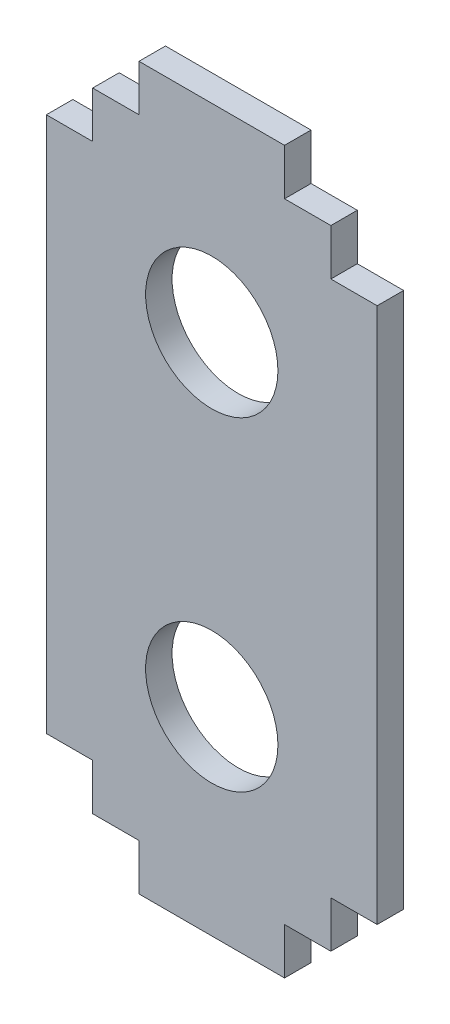
ISO-10303-21;
HEADER;
FILE_DESCRIPTION(('STEP AP214'),'2;1');
FILE_NAME('part.step','',(''),(''),'','','');
FILE_SCHEMA(('AUTOMOTIVE_DESIGN { 1 0 10303 214 1 1 1 1 }'));
ENDSEC;
DATA;
#1=APPLICATION_CONTEXT('core data for automotive mechanical design processes');
#2=APPLICATION_PROTOCOL_DEFINITION('international standard','automotive_design',2000,#1);
#3=PRODUCT_CONTEXT('',#1,'mechanical');
#4=PRODUCT('Part','Part','',(#3));
#5=PRODUCT_RELATED_PRODUCT_CATEGORY('part','',(#4));
#6=PRODUCT_DEFINITION_FORMATION('','',#4);
#7=PRODUCT_DEFINITION_CONTEXT('part definition',#1,'design');
#8=PRODUCT_DEFINITION('design','',#6,#7);
#9=PRODUCT_DEFINITION_SHAPE('','',#8);
#10=(LENGTH_UNIT() NAMED_UNIT(*) SI_UNIT(.MILLI.,.METRE.));
#11=(NAMED_UNIT(*) PLANE_ANGLE_UNIT() SI_UNIT($,.RADIAN.));
#12=(NAMED_UNIT(*) SI_UNIT($,.STERADIAN.) SOLID_ANGLE_UNIT());
#13=UNCERTAINTY_MEASURE_WITH_UNIT(LENGTH_MEASURE(1.E-05),#10,'distance_accuracy_value','');
#14=(GEOMETRIC_REPRESENTATION_CONTEXT(3) GLOBAL_UNCERTAINTY_ASSIGNED_CONTEXT((#13)) GLOBAL_UNIT_ASSIGNED_CONTEXT((#10,
#11,#12)) REPRESENTATION_CONTEXT('',''));
#15=CARTESIAN_POINT('',(0.,0.,0.));
#16=DIRECTION('',(0.,0.,1.));
#17=DIRECTION('',(1.,0.,0.));
#18=AXIS2_PLACEMENT_3D('',#15,#16,#17);
#19=CARTESIAN_POINT('',(-25.,16.,-4.));
#20=DIRECTION('',(0.,1.,0.));
#21=DIRECTION('',(0.,0.,1.));
#22=AXIS2_PLACEMENT_3D('',#19,#20,#21);
#23=PLANE('',#22);
#24=DIRECTION('',(-1.,0.,0.));
#25=VECTOR('',#24,1.);
#26=CARTESIAN_POINT('',(-25.,16.,0.));
#27=LINE('',#26,#25);
#28=CARTESIAN_POINT('',(-18.,16.,0.));
#29=VERTEX_POINT('',#28);
#30=CARTESIAN_POINT('',(-25.,16.,0.));
#31=VERTEX_POINT('',#30);
#32=EDGE_CURVE('E205',#29,#31,#27,.T.);
#33=ORIENTED_EDGE('',*,*,#32,.F.);
#34=DIRECTION('',(0.,0.,1.));
#35=VECTOR('',#34,1.);
#36=CARTESIAN_POINT('',(-18.,16.,-4.));
#37=LINE('',#36,#35);
#38=CARTESIAN_POINT('',(-18.,16.,-4.));
#39=VERTEX_POINT('',#38);
#40=EDGE_CURVE('E11',#39,#29,#37,.T.);
#41=ORIENTED_EDGE('',*,*,#40,.F.);
#42=DIRECTION('',(-1.,0.,0.));
#43=VECTOR('',#42,1.);
#44=CARTESIAN_POINT('',(-25.,16.,-4.));
#45=LINE('',#44,#43);
#46=CARTESIAN_POINT('',(-25.,16.,-4.));
#47=VERTEX_POINT('',#46);
#48=EDGE_CURVE('E262',#39,#47,#45,.T.);
#49=ORIENTED_EDGE('',*,*,#48,.T.);
#50=DIRECTION('',(0.,0.,1.));
#51=VECTOR('',#50,1.);
#52=CARTESIAN_POINT('',(-25.,16.,-4.));
#53=LINE('',#52,#51);
#54=EDGE_CURVE('E39',#47,#31,#53,.T.);
#55=ORIENTED_EDGE('',*,*,#54,.T.);
#56=EDGE_LOOP('',(#33,#41,#49,#55));
#57=FACE_BOUND('',#56,.T.);
#58=ADVANCED_FACE('F36',(#57),#23,.T.);
#59=CARTESIAN_POINT('',(-18.,16.,-4.));
#60=DIRECTION('',(-1.,0.,0.));
#61=DIRECTION('',(0.,0.,1.));
#62=AXIS2_PLACEMENT_3D('',#59,#60,#61);
#63=PLANE('',#62);
#64=DIRECTION('',(0.,-1.,0.));
#65=VECTOR('',#64,1.);
#66=CARTESIAN_POINT('',(-18.,16.,0.));
#67=LINE('',#66,#65);
#68=CARTESIAN_POINT('',(-18.,23.,0.));
#69=VERTEX_POINT('',#68);
#70=EDGE_CURVE('E260',#69,#29,#67,.T.);
#71=ORIENTED_EDGE('',*,*,#70,.F.);
#72=DIRECTION('',(0.,0.,1.));
#73=VECTOR('',#72,1.);
#74=CARTESIAN_POINT('',(-18.,23.,-4.));
#75=LINE('',#74,#73);
#76=CARTESIAN_POINT('',(-18.,23.,-4.));
#77=VERTEX_POINT('',#76);
#78=EDGE_CURVE('E45',#77,#69,#75,.T.);
#79=ORIENTED_EDGE('',*,*,#78,.F.);
#80=DIRECTION('',(0.,-1.,0.));
#81=VECTOR('',#80,1.);
#82=CARTESIAN_POINT('',(-18.,16.,-4.));
#83=LINE('',#82,#81);
#84=EDGE_CURVE('E195',#77,#39,#83,.T.);
#85=ORIENTED_EDGE('',*,*,#84,.T.);
#86=ORIENTED_EDGE('',*,*,#40,.T.);
#87=EDGE_LOOP('',(#71,#79,#85,#86));
#88=FACE_BOUND('',#87,.T.);
#89=ADVANCED_FACE('F298',(#88),#63,.T.);
#90=CARTESIAN_POINT('',(-18.,23.,-4.));
#91=DIRECTION('',(0.,1.,0.));
#92=DIRECTION('',(0.,0.,1.));
#93=AXIS2_PLACEMENT_3D('',#90,#91,#92);
#94=PLANE('',#93);
#95=DIRECTION('',(-1.,0.,0.));
#96=VECTOR('',#95,1.);
#97=CARTESIAN_POINT('',(-18.,23.,0.));
#98=LINE('',#97,#96);
#99=CARTESIAN_POINT('',(-11.,23.,0.));
#100=VERTEX_POINT('',#99);
#101=EDGE_CURVE('E182',#100,#69,#98,.T.);
#102=ORIENTED_EDGE('',*,*,#101,.F.);
#103=DIRECTION('',(0.,0.,1.));
#104=VECTOR('',#103,1.);
#105=CARTESIAN_POINT('',(-11.,23.,-4.));
#106=LINE('',#105,#104);
#107=CARTESIAN_POINT('',(-11.,23.,-4.));
#108=VERTEX_POINT('',#107);
#109=EDGE_CURVE('E177',#108,#100,#106,.T.);
#110=ORIENTED_EDGE('',*,*,#109,.F.);
#111=DIRECTION('',(-1.,0.,0.));
#112=VECTOR('',#111,1.);
#113=CARTESIAN_POINT('',(-18.,23.,-4.));
#114=LINE('',#113,#112);
#115=EDGE_CURVE('E180',#108,#77,#114,.T.);
#116=ORIENTED_EDGE('',*,*,#115,.T.);
#117=ORIENTED_EDGE('',*,*,#78,.T.);
#118=EDGE_LOOP('',(#102,#110,#116,#117));
#119=FACE_BOUND('',#118,.T.);
#120=ADVANCED_FACE('F179',(#119),#94,.T.);
#121=CARTESIAN_POINT('',(-11.,23.,-4.));
#122=DIRECTION('',(-1.,0.,0.));
#123=DIRECTION('',(0.,0.,1.));
#124=AXIS2_PLACEMENT_3D('',#121,#122,#123);
#125=PLANE('',#124);
#126=DIRECTION('',(0.,-1.,0.));
#127=VECTOR('',#126,1.);
#128=CARTESIAN_POINT('',(-11.,23.,0.));
#129=LINE('',#128,#127);
#130=CARTESIAN_POINT('',(-11.,30.,0.));
#131=VERTEX_POINT('',#130);
#132=EDGE_CURVE('E257',#131,#100,#129,.T.);
#133=ORIENTED_EDGE('',*,*,#132,.F.);
#134=DIRECTION('',(0.,0.,1.));
#135=VECTOR('',#134,1.);
#136=CARTESIAN_POINT('',(-11.,30.,-4.));
#137=LINE('',#136,#135);
#138=CARTESIAN_POINT('',(-11.,30.,-4.));
#139=VERTEX_POINT('',#138);
#140=EDGE_CURVE('E187',#139,#131,#137,.T.);
#141=ORIENTED_EDGE('',*,*,#140,.F.);
#142=DIRECTION('',(0.,-1.,0.));
#143=VECTOR('',#142,1.);
#144=CARTESIAN_POINT('',(-11.,23.,-4.));
#145=LINE('',#144,#143);
#146=EDGE_CURVE('E193',#139,#108,#145,.T.);
#147=ORIENTED_EDGE('',*,*,#146,.T.);
#148=ORIENTED_EDGE('',*,*,#109,.T.);
#149=EDGE_LOOP('',(#133,#141,#147,#148));
#150=FACE_BOUND('',#149,.T.);
#151=ADVANCED_FACE('F197',(#150),#125,.T.);
#152=CARTESIAN_POINT('',(-11.,30.,-4.));
#153=DIRECTION('',(0.,1.,0.));
#154=DIRECTION('',(0.,0.,1.));
#155=AXIS2_PLACEMENT_3D('',#152,#153,#154);
#156=PLANE('',#155);
#157=DIRECTION('',(-1.,0.,0.));
#158=VECTOR('',#157,1.);
#159=CARTESIAN_POINT('',(-11.,30.,0.));
#160=LINE('',#159,#158);
#161=CARTESIAN_POINT('',(10.9999999999998,30.,0.));
#162=VERTEX_POINT('',#161);
#163=EDGE_CURVE('E254',#162,#131,#160,.T.);
#164=ORIENTED_EDGE('',*,*,#163,.F.);
#165=DIRECTION('',(0.,0.,1.));
#166=VECTOR('',#165,1.);
#167=CARTESIAN_POINT('',(10.9999999999998,30.,-4.));
#168=LINE('',#167,#166);
#169=CARTESIAN_POINT('',(10.9999999999998,30.,-4.));
#170=VERTEX_POINT('',#169);
#171=EDGE_CURVE('E266',#170,#162,#168,.T.);
#172=ORIENTED_EDGE('',*,*,#171,.F.);
#173=DIRECTION('',(-1.,0.,0.));
#174=VECTOR('',#173,1.);
#175=CARTESIAN_POINT('',(-11.,30.,-4.));
#176=LINE('',#175,#174);
#177=EDGE_CURVE('E198',#170,#139,#176,.T.);
#178=ORIENTED_EDGE('',*,*,#177,.T.);
#179=ORIENTED_EDGE('',*,*,#140,.T.);
#180=EDGE_LOOP('',(#164,#172,#178,#179));
#181=FACE_BOUND('',#180,.T.);
#182=ADVANCED_FACE('F311',(#181),#156,.T.);
#183=CARTESIAN_POINT('',(10.9999999999998,23.,-4.));
#184=DIRECTION('',(1.,0.,0.));
#185=DIRECTION('',(0.,1.,0.));
#186=AXIS2_PLACEMENT_3D('',#183,#184,#185);
#187=PLANE('',#186);
#188=DIRECTION('',(0.,1.,0.));
#189=VECTOR('',#188,1.);
#190=CARTESIAN_POINT('',(10.9999999999998,23.,0.));
#191=LINE('',#190,#189);
#192=CARTESIAN_POINT('',(10.9999999999998,23.,0.));
#193=VERTEX_POINT('',#192);
#194=EDGE_CURVE('E251',#193,#162,#191,.T.);
#195=ORIENTED_EDGE('',*,*,#194,.F.);
#196=DIRECTION('',(0.,0.,1.));
#197=VECTOR('',#196,1.);
#198=CARTESIAN_POINT('',(10.9999999999998,23.,-4.));
#199=LINE('',#198,#197);
#200=CARTESIAN_POINT('',(10.9999999999998,23.,-4.));
#201=VERTEX_POINT('',#200);
#202=EDGE_CURVE('E268',#201,#193,#199,.T.);
#203=ORIENTED_EDGE('',*,*,#202,.F.);
#204=DIRECTION('',(0.,1.,0.));
#205=VECTOR('',#204,1.);
#206=CARTESIAN_POINT('',(10.9999999999998,23.,-4.));
#207=LINE('',#206,#205);
#208=EDGE_CURVE('E200',#201,#170,#207,.T.);
#209=ORIENTED_EDGE('',*,*,#208,.T.);
#210=ORIENTED_EDGE('',*,*,#171,.T.);
#211=EDGE_LOOP('',(#195,#203,#209,#210));
#212=FACE_BOUND('',#211,.T.);
#213=ADVANCED_FACE('F314',(#212),#187,.T.);
#214=CARTESIAN_POINT('',(17.9999999999999,23.,-4.));
#215=DIRECTION('',(0.,1.,0.));
#216=DIRECTION('',(0.,0.,1.));
#217=AXIS2_PLACEMENT_3D('',#214,#215,#216);
#218=PLANE('',#217);
#219=DIRECTION('',(-1.,0.,0.));
#220=VECTOR('',#219,1.);
#221=CARTESIAN_POINT('',(17.9999999999999,23.,0.));
#222=LINE('',#221,#220);
#223=CARTESIAN_POINT('',(17.9999999999999,23.,0.));
#224=VERTEX_POINT('',#223);
#225=EDGE_CURVE('E248',#224,#193,#222,.T.);
#226=ORIENTED_EDGE('',*,*,#225,.F.);
#227=DIRECTION('',(0.,0.,1.));
#228=VECTOR('',#227,1.);
#229=CARTESIAN_POINT('',(17.9999999999999,23.,-4.));
#230=LINE('',#229,#228);
#231=CARTESIAN_POINT('',(17.9999999999999,23.,-4.));
#232=VERTEX_POINT('',#231);
#233=EDGE_CURVE('E270',#232,#224,#230,.T.);
#234=ORIENTED_EDGE('',*,*,#233,.F.);
#235=DIRECTION('',(-1.,0.,0.));
#236=VECTOR('',#235,1.);
#237=CARTESIAN_POINT('',(17.9999999999999,23.,-4.));
#238=LINE('',#237,#236);
#239=EDGE_CURVE('E444',#232,#201,#238,.T.);
#240=ORIENTED_EDGE('',*,*,#239,.T.);
#241=ORIENTED_EDGE('',*,*,#202,.T.);
#242=EDGE_LOOP('',(#226,#234,#240,#241));
#243=FACE_BOUND('',#242,.T.);
#244=ADVANCED_FACE('F318',(#243),#218,.T.);
#245=CARTESIAN_POINT('',(17.9999999999999,16.,-4.));
#246=DIRECTION('',(1.,0.,0.));
#247=DIRECTION('',(0.,1.,0.));
#248=AXIS2_PLACEMENT_3D('',#245,#246,#247);
#249=PLANE('',#248);
#250=DIRECTION('',(0.,1.,0.));
#251=VECTOR('',#250,1.);
#252=CARTESIAN_POINT('',(17.9999999999999,16.,0.));
#253=LINE('',#252,#251);
#254=CARTESIAN_POINT('',(17.9999999999999,16.,0.));
#255=VERTEX_POINT('',#254);
#256=EDGE_CURVE('E245',#255,#224,#253,.T.);
#257=ORIENTED_EDGE('',*,*,#256,.F.);
#258=DIRECTION('',(0.,0.,1.));
#259=VECTOR('',#258,1.);
#260=CARTESIAN_POINT('',(17.9999999999999,16.,-4.));
#261=LINE('',#260,#259);
#262=CARTESIAN_POINT('',(17.9999999999999,16.,-4.));
#263=VERTEX_POINT('',#262);
#264=EDGE_CURVE('E272',#263,#255,#261,.T.);
#265=ORIENTED_EDGE('',*,*,#264,.F.);
#266=DIRECTION('',(0.,1.,0.));
#267=VECTOR('',#266,1.);
#268=CARTESIAN_POINT('',(17.9999999999999,16.,-4.));
#269=LINE('',#268,#267);
#270=EDGE_CURVE('E441',#263,#232,#269,.T.);
#271=ORIENTED_EDGE('',*,*,#270,.T.);
#272=ORIENTED_EDGE('',*,*,#233,.T.);
#273=EDGE_LOOP('',(#257,#265,#271,#272));
#274=FACE_BOUND('',#273,.T.);
#275=ADVANCED_FACE('F322',(#274),#249,.T.);
#276=CARTESIAN_POINT('',(24.9999999999999,16.,-4.));
#277=DIRECTION('',(0.,1.,0.));
#278=DIRECTION('',(0.,0.,1.));
#279=AXIS2_PLACEMENT_3D('',#276,#277,#278);
#280=PLANE('',#279);
#281=DIRECTION('',(-1.,0.,0.));
#282=VECTOR('',#281,1.);
#283=CARTESIAN_POINT('',(24.9999999999999,16.,0.));
#284=LINE('',#283,#282);
#285=CARTESIAN_POINT('',(24.9999999999999,16.,0.));
#286=VERTEX_POINT('',#285);
#287=EDGE_CURVE('E242',#286,#255,#284,.T.);
#288=ORIENTED_EDGE('',*,*,#287,.F.);
#289=DIRECTION('',(0.,0.,1.));
#290=VECTOR('',#289,1.);
#291=CARTESIAN_POINT('',(24.9999999999999,16.,-4.));
#292=LINE('',#291,#290);
#293=CARTESIAN_POINT('',(24.9999999999999,16.,-4.));
#294=VERTEX_POINT('',#293);
#295=EDGE_CURVE('E274',#294,#286,#292,.T.);
#296=ORIENTED_EDGE('',*,*,#295,.F.);
#297=DIRECTION('',(-1.,0.,0.));
#298=VECTOR('',#297,1.);
#299=CARTESIAN_POINT('',(24.9999999999999,16.,-4.));
#300=LINE('',#299,#298);
#301=EDGE_CURVE('E438',#294,#263,#300,.T.);
#302=ORIENTED_EDGE('',*,*,#301,.T.);
#303=ORIENTED_EDGE('',*,*,#264,.T.);
#304=EDGE_LOOP('',(#288,#296,#302,#303));
#305=FACE_BOUND('',#304,.T.);
#306=ADVANCED_FACE('F326',(#305),#280,.T.);
#307=CARTESIAN_POINT('',(24.9999999999999,16.,-4.));
#308=DIRECTION('',(1.,0.,0.));
#309=DIRECTION('',(0.,1.,0.));
#310=AXIS2_PLACEMENT_3D('',#307,#308,#309);
#311=PLANE('',#310);
#312=DIRECTION('',(0.,1.,0.));
#313=VECTOR('',#312,1.);
#314=CARTESIAN_POINT('',(24.9999999999999,16.,0.));
#315=LINE('',#314,#313);
#316=CARTESIAN_POINT('',(25.0000000000005,-64.9999999999998,0.));
#317=VERTEX_POINT('',#316);
#318=EDGE_CURVE('E239',#317,#286,#315,.T.);
#319=ORIENTED_EDGE('',*,*,#318,.F.);
#320=DIRECTION('',(0.,0.,1.));
#321=VECTOR('',#320,1.);
#322=CARTESIAN_POINT('',(25.0000000000005,-64.9999999999998,-4.));
#323=LINE('',#322,#321);
#324=CARTESIAN_POINT('',(25.0000000000005,-64.9999999999998,-4.));
#325=VERTEX_POINT('',#324);
#326=EDGE_CURVE('E276',#325,#317,#323,.T.);
#327=ORIENTED_EDGE('',*,*,#326,.F.);
#328=DIRECTION('',(0.,1.,0.));
#329=VECTOR('',#328,1.);
#330=CARTESIAN_POINT('',(24.9999999999999,16.,-4.));
#331=LINE('',#330,#329);
#332=EDGE_CURVE('E435',#325,#294,#331,.T.);
#333=ORIENTED_EDGE('',*,*,#332,.T.);
#334=ORIENTED_EDGE('',*,*,#295,.T.);
#335=EDGE_LOOP('',(#319,#327,#333,#334));
#336=FACE_BOUND('',#335,.T.);
#337=ADVANCED_FACE('F330',(#336),#311,.T.);
#338=CARTESIAN_POINT('',(25.0000000000005,-64.9999999999998,-4.));
#339=DIRECTION('',(0.,-1.,0.));
#340=DIRECTION('',(0.,0.,-1.));
#341=AXIS2_PLACEMENT_3D('',#338,#339,#340);
#342=PLANE('',#341);
#343=DIRECTION('',(1.,0.,0.));
#344=VECTOR('',#343,1.);
#345=CARTESIAN_POINT('',(25.0000000000005,-64.9999999999998,0.));
#346=LINE('',#345,#344);
#347=CARTESIAN_POINT('',(18.0000000000005,-64.9999999999998,0.));
#348=VERTEX_POINT('',#347);
#349=EDGE_CURVE('E236',#348,#317,#346,.T.);
#350=ORIENTED_EDGE('',*,*,#349,.F.);
#351=DIRECTION('',(0.,0.,1.));
#352=VECTOR('',#351,1.);
#353=CARTESIAN_POINT('',(18.0000000000005,-64.9999999999998,-4.));
#354=LINE('',#353,#352);
#355=CARTESIAN_POINT('',(18.0000000000005,-64.9999999999998,-4.));
#356=VERTEX_POINT('',#355);
#357=EDGE_CURVE('E278',#356,#348,#354,.T.);
#358=ORIENTED_EDGE('',*,*,#357,.F.);
#359=DIRECTION('',(1.,0.,0.));
#360=VECTOR('',#359,1.);
#361=CARTESIAN_POINT('',(25.0000000000005,-64.9999999999998,-4.));
#362=LINE('',#361,#360);
#363=EDGE_CURVE('E432',#356,#325,#362,.T.);
#364=ORIENTED_EDGE('',*,*,#363,.T.);
#365=ORIENTED_EDGE('',*,*,#326,.T.);
#366=EDGE_LOOP('',(#350,#358,#364,#365));
#367=FACE_BOUND('',#366,.T.);
#368=ADVANCED_FACE('F334',(#367),#342,.T.);
#369=CARTESIAN_POINT('',(18.0000000000005,-64.9999999999998,-4.));
#370=DIRECTION('',(1.,0.,0.));
#371=DIRECTION('',(0.,1.,0.));
#372=AXIS2_PLACEMENT_3D('',#369,#370,#371);
#373=PLANE('',#372);
#374=DIRECTION('',(0.,1.,0.));
#375=VECTOR('',#374,1.);
#376=CARTESIAN_POINT('',(18.0000000000005,-64.9999999999998,0.));
#377=LINE('',#376,#375);
#378=CARTESIAN_POINT('',(18.0000000000005,-71.9999999999998,0.));
#379=VERTEX_POINT('',#378);
#380=EDGE_CURVE('E233',#379,#348,#377,.T.);
#381=ORIENTED_EDGE('',*,*,#380,.F.);
#382=DIRECTION('',(0.,0.,1.));
#383=VECTOR('',#382,1.);
#384=CARTESIAN_POINT('',(18.0000000000005,-71.9999999999998,-4.));
#385=LINE('',#384,#383);
#386=CARTESIAN_POINT('',(18.0000000000005,-71.9999999999998,-4.));
#387=VERTEX_POINT('',#386);
#388=EDGE_CURVE('E280',#387,#379,#385,.T.);
#389=ORIENTED_EDGE('',*,*,#388,.F.);
#390=DIRECTION('',(0.,1.,0.));
#391=VECTOR('',#390,1.);
#392=CARTESIAN_POINT('',(18.0000000000005,-64.9999999999998,-4.));
#393=LINE('',#392,#391);
#394=EDGE_CURVE('E429',#387,#356,#393,.T.);
#395=ORIENTED_EDGE('',*,*,#394,.T.);
#396=ORIENTED_EDGE('',*,*,#357,.T.);
#397=EDGE_LOOP('',(#381,#389,#395,#396));
#398=FACE_BOUND('',#397,.T.);
#399=ADVANCED_FACE('F338',(#398),#373,.T.);
#400=CARTESIAN_POINT('',(18.0000000000005,-71.9999999999998,-4.));
#401=DIRECTION('',(0.,-1.,0.));
#402=DIRECTION('',(1.,0.,0.));
#403=AXIS2_PLACEMENT_3D('',#400,#401,#402);
#404=PLANE('',#403);
#405=DIRECTION('',(1.,0.,0.));
#406=VECTOR('',#405,1.);
#407=CARTESIAN_POINT('',(18.0000000000005,-71.9999999999998,0.));
#408=LINE('',#407,#406);
#409=CARTESIAN_POINT('',(11.0000000000005,-72.,0.));
#410=VERTEX_POINT('',#409);
#411=EDGE_CURVE('E230',#410,#379,#408,.T.);
#412=ORIENTED_EDGE('',*,*,#411,.F.);
#413=DIRECTION('',(0.,0.,1.));
#414=VECTOR('',#413,1.);
#415=CARTESIAN_POINT('',(11.0000000000005,-72.,-4.));
#416=LINE('',#415,#414);
#417=CARTESIAN_POINT('',(11.0000000000005,-72.,-4.));
#418=VERTEX_POINT('',#417);
#419=EDGE_CURVE('E282',#418,#410,#416,.T.);
#420=ORIENTED_EDGE('',*,*,#419,.F.);
#421=DIRECTION('',(1.,0.,0.));
#422=VECTOR('',#421,1.);
#423=CARTESIAN_POINT('',(18.0000000000005,-71.9999999999998,-4.));
#424=LINE('',#423,#422);
#425=EDGE_CURVE('E426',#418,#387,#424,.T.);
#426=ORIENTED_EDGE('',*,*,#425,.T.);
#427=ORIENTED_EDGE('',*,*,#388,.T.);
#428=EDGE_LOOP('',(#412,#420,#426,#427));
#429=FACE_BOUND('',#428,.T.);
#430=ADVANCED_FACE('F342',(#429),#404,.T.);
#431=CARTESIAN_POINT('',(11.0000000000005,-72.,-4.));
#432=DIRECTION('',(1.,0.,0.));
#433=DIRECTION('',(0.,1.,0.));
#434=AXIS2_PLACEMENT_3D('',#431,#432,#433);
#435=PLANE('',#434);
#436=DIRECTION('',(0.,1.,0.));
#437=VECTOR('',#436,1.);
#438=CARTESIAN_POINT('',(11.0000000000005,-72.,0.));
#439=LINE('',#438,#437);
#440=CARTESIAN_POINT('',(11.0000000000005,-79.,0.));
#441=VERTEX_POINT('',#440);
#442=EDGE_CURVE('E227',#441,#410,#439,.T.);
#443=ORIENTED_EDGE('',*,*,#442,.F.);
#444=DIRECTION('',(0.,0.,1.));
#445=VECTOR('',#444,1.);
#446=CARTESIAN_POINT('',(11.0000000000005,-79.,-4.));
#447=LINE('',#446,#445);
#448=CARTESIAN_POINT('',(11.0000000000005,-79.,-4.));
#449=VERTEX_POINT('',#448);
#450=EDGE_CURVE('E284',#449,#441,#447,.T.);
#451=ORIENTED_EDGE('',*,*,#450,.F.);
#452=DIRECTION('',(0.,1.,0.));
#453=VECTOR('',#452,1.);
#454=CARTESIAN_POINT('',(11.0000000000005,-72.,-4.));
#455=LINE('',#454,#453);
#456=EDGE_CURVE('E423',#449,#418,#455,.T.);
#457=ORIENTED_EDGE('',*,*,#456,.T.);
#458=ORIENTED_EDGE('',*,*,#419,.T.);
#459=EDGE_LOOP('',(#443,#451,#457,#458));
#460=FACE_BOUND('',#459,.T.);
#461=ADVANCED_FACE('F346',(#460),#435,.T.);
#462=CARTESIAN_POINT('',(-11.,-79.,-4.));
#463=DIRECTION('',(0.,-1.,0.));
#464=DIRECTION('',(0.,0.,-1.));
#465=AXIS2_PLACEMENT_3D('',#462,#463,#464);
#466=PLANE('',#465);
#467=DIRECTION('',(1.,0.,0.));
#468=VECTOR('',#467,1.);
#469=CARTESIAN_POINT('',(-11.,-79.,0.));
#470=LINE('',#469,#468);
#471=CARTESIAN_POINT('',(-11.,-79.,0.));
#472=VERTEX_POINT('',#471);
#473=EDGE_CURVE('E224',#472,#441,#470,.T.);
#474=ORIENTED_EDGE('',*,*,#473,.F.);
#475=DIRECTION('',(0.,0.,1.));
#476=VECTOR('',#475,1.);
#477=CARTESIAN_POINT('',(-11.,-79.,-4.));
#478=LINE('',#477,#476);
#479=CARTESIAN_POINT('',(-11.,-79.,-4.));
#480=VERTEX_POINT('',#479);
#481=EDGE_CURVE('E286',#480,#472,#478,.T.);
#482=ORIENTED_EDGE('',*,*,#481,.F.);
#483=DIRECTION('',(1.,0.,0.));
#484=VECTOR('',#483,1.);
#485=CARTESIAN_POINT('',(-11.,-79.,-4.));
#486=LINE('',#485,#484);
#487=EDGE_CURVE('E420',#480,#449,#486,.T.);
#488=ORIENTED_EDGE('',*,*,#487,.T.);
#489=ORIENTED_EDGE('',*,*,#450,.T.);
#490=EDGE_LOOP('',(#474,#482,#488,#489));
#491=FACE_BOUND('',#490,.T.);
#492=ADVANCED_FACE('F350',(#491),#466,.T.);
#493=CARTESIAN_POINT('',(-11.,-72.,-4.));
#494=DIRECTION('',(-1.,0.,0.));
#495=DIRECTION('',(0.,0.,1.));
#496=AXIS2_PLACEMENT_3D('',#493,#494,#495);
#497=PLANE('',#496);
#498=DIRECTION('',(0.,-1.,0.));
#499=VECTOR('',#498,1.);
#500=CARTESIAN_POINT('',(-11.,-72.,0.));
#501=LINE('',#500,#499);
#502=CARTESIAN_POINT('',(-11.,-72.,0.));
#503=VERTEX_POINT('',#502);
#504=EDGE_CURVE('E221',#503,#472,#501,.T.);
#505=ORIENTED_EDGE('',*,*,#504,.F.);
#506=DIRECTION('',(0.,0.,1.));
#507=VECTOR('',#506,1.);
#508=CARTESIAN_POINT('',(-11.,-72.,-4.));
#509=LINE('',#508,#507);
#510=CARTESIAN_POINT('',(-11.,-72.,-4.));
#511=VERTEX_POINT('',#510);
#512=EDGE_CURVE('E288',#511,#503,#509,.T.);
#513=ORIENTED_EDGE('',*,*,#512,.F.);
#514=DIRECTION('',(0.,-1.,0.));
#515=VECTOR('',#514,1.);
#516=CARTESIAN_POINT('',(-11.,-72.,-4.));
#517=LINE('',#516,#515);
#518=EDGE_CURVE('E417',#511,#480,#517,.T.);
#519=ORIENTED_EDGE('',*,*,#518,.T.);
#520=ORIENTED_EDGE('',*,*,#481,.T.);
#521=EDGE_LOOP('',(#505,#513,#519,#520));
#522=FACE_BOUND('',#521,.T.);
#523=ADVANCED_FACE('F354',(#522),#497,.T.);
#524=CARTESIAN_POINT('',(-18.,-72.,-4.));
#525=DIRECTION('',(0.,-1.,0.));
#526=DIRECTION('',(0.,0.,-1.));
#527=AXIS2_PLACEMENT_3D('',#524,#525,#526);
#528=PLANE('',#527);
#529=DIRECTION('',(1.,0.,0.));
#530=VECTOR('',#529,1.);
#531=CARTESIAN_POINT('',(-18.,-72.,0.));
#532=LINE('',#531,#530);
#533=CARTESIAN_POINT('',(-18.,-72.,0.));
#534=VERTEX_POINT('',#533);
#535=EDGE_CURVE('E218',#534,#503,#532,.T.);
#536=ORIENTED_EDGE('',*,*,#535,.F.);
#537=DIRECTION('',(0.,0.,1.));
#538=VECTOR('',#537,1.);
#539=CARTESIAN_POINT('',(-18.,-72.,-4.));
#540=LINE('',#539,#538);
#541=CARTESIAN_POINT('',(-18.,-72.,-4.));
#542=VERTEX_POINT('',#541);
#543=EDGE_CURVE('E290',#542,#534,#540,.T.);
#544=ORIENTED_EDGE('',*,*,#543,.F.);
#545=DIRECTION('',(1.,0.,0.));
#546=VECTOR('',#545,1.);
#547=CARTESIAN_POINT('',(-18.,-72.,-4.));
#548=LINE('',#547,#546);
#549=EDGE_CURVE('E414',#542,#511,#548,.T.);
#550=ORIENTED_EDGE('',*,*,#549,.T.);
#551=ORIENTED_EDGE('',*,*,#512,.T.);
#552=EDGE_LOOP('',(#536,#544,#550,#551));
#553=FACE_BOUND('',#552,.T.);
#554=ADVANCED_FACE('F358',(#553),#528,.T.);
#555=CARTESIAN_POINT('',(-18.,-65.,-4.));
#556=DIRECTION('',(-1.,0.,0.));
#557=DIRECTION('',(0.,0.,1.));
#558=AXIS2_PLACEMENT_3D('',#555,#556,#557);
#559=PLANE('',#558);
#560=DIRECTION('',(0.,-1.,0.));
#561=VECTOR('',#560,1.);
#562=CARTESIAN_POINT('',(-18.,-65.,0.));
#563=LINE('',#562,#561);
#564=CARTESIAN_POINT('',(-18.,-65.,0.));
#565=VERTEX_POINT('',#564);
#566=EDGE_CURVE('E215',#565,#534,#563,.T.);
#567=ORIENTED_EDGE('',*,*,#566,.F.);
#568=DIRECTION('',(0.,0.,1.));
#569=VECTOR('',#568,1.);
#570=CARTESIAN_POINT('',(-18.,-65.,-4.));
#571=LINE('',#570,#569);
#572=CARTESIAN_POINT('',(-18.,-65.,-4.));
#573=VERTEX_POINT('',#572);
#574=EDGE_CURVE('E292',#573,#565,#571,.T.);
#575=ORIENTED_EDGE('',*,*,#574,.F.);
#576=DIRECTION('',(0.,-1.,0.));
#577=VECTOR('',#576,1.);
#578=CARTESIAN_POINT('',(-18.,-65.,-4.));
#579=LINE('',#578,#577);
#580=EDGE_CURVE('E411',#573,#542,#579,.T.);
#581=ORIENTED_EDGE('',*,*,#580,.T.);
#582=ORIENTED_EDGE('',*,*,#543,.T.);
#583=EDGE_LOOP('',(#567,#575,#581,#582));
#584=FACE_BOUND('',#583,.T.);
#585=ADVANCED_FACE('F362',(#584),#559,.T.);
#586=CARTESIAN_POINT('',(-25.,-65.,-4.));
#587=DIRECTION('',(0.,-1.,0.));
#588=DIRECTION('',(0.,0.,-1.));
#589=AXIS2_PLACEMENT_3D('',#586,#587,#588);
#590=PLANE('',#589);
#591=DIRECTION('',(1.,0.,0.));
#592=VECTOR('',#591,1.);
#593=CARTESIAN_POINT('',(-25.,-65.,0.));
#594=LINE('',#593,#592);
#595=CARTESIAN_POINT('',(-25.,-65.,0.));
#596=VERTEX_POINT('',#595);
#597=EDGE_CURVE('E212',#596,#565,#594,.T.);
#598=ORIENTED_EDGE('',*,*,#597,.F.);
#599=DIRECTION('',(0.,0.,1.));
#600=VECTOR('',#599,1.);
#601=CARTESIAN_POINT('',(-25.,-65.,-4.));
#602=LINE('',#601,#600);
#603=CARTESIAN_POINT('',(-25.,-65.,-4.));
#604=VERTEX_POINT('',#603);
#605=EDGE_CURVE('E293',#604,#596,#602,.T.);
#606=ORIENTED_EDGE('',*,*,#605,.F.);
#607=DIRECTION('',(1.,0.,0.));
#608=VECTOR('',#607,1.);
#609=CARTESIAN_POINT('',(-25.,-65.,-4.));
#610=LINE('',#609,#608);
#611=EDGE_CURVE('E408',#604,#573,#610,.T.);
#612=ORIENTED_EDGE('',*,*,#611,.T.);
#613=ORIENTED_EDGE('',*,*,#574,.T.);
#614=EDGE_LOOP('',(#598,#606,#612,#613));
#615=FACE_BOUND('',#614,.T.);
#616=ADVANCED_FACE('F366',(#615),#590,.T.);
#617=CARTESIAN_POINT('',(-25.,16.,-4.));
#618=DIRECTION('',(-1.,0.,0.));
#619=DIRECTION('',(0.,0.,1.));
#620=AXIS2_PLACEMENT_3D('',#617,#618,#619);
#621=PLANE('',#620);
#622=DIRECTION('',(0.,-1.,0.));
#623=VECTOR('',#622,1.);
#624=CARTESIAN_POINT('',(-25.,16.,0.));
#625=LINE('',#624,#623);
#626=EDGE_CURVE('E208',#31,#596,#625,.T.);
#627=ORIENTED_EDGE('',*,*,#626,.F.);
#628=ORIENTED_EDGE('',*,*,#54,.F.);
#629=DIRECTION('',(0.,-1.,0.));
#630=VECTOR('',#629,1.);
#631=CARTESIAN_POINT('',(-25.,16.,-4.));
#632=LINE('',#631,#630);
#633=EDGE_CURVE('E406',#47,#604,#632,.T.);
#634=ORIENTED_EDGE('',*,*,#633,.T.);
#635=ORIENTED_EDGE('',*,*,#605,.T.);
#636=EDGE_LOOP('',(#627,#628,#634,#635));
#637=FACE_BOUND('',#636,.T.);
#638=ADVANCED_FACE('F295',(#637),#621,.T.);
#639=CARTESIAN_POINT('',(0.,0.,-4.));
#640=DIRECTION('',(0.,0.,1.));
#641=DIRECTION('',(1.,0.,0.));
#642=AXIS2_PLACEMENT_3D('',#639,#640,#641);
#643=PLANE('',#642);
#644=CARTESIAN_POINT('',(0.,-49.,-4.));
#645=DIRECTION('',(0.,0.,1.));
#646=DIRECTION('',(1.,0.,0.));
#647=AXIS2_PLACEMENT_3D('',#644,#645,#646);
#648=CIRCLE('',#647,10.);
#649=CARTESIAN_POINT('',(10.,-49.,-4.));
#650=VERTEX_POINT('',#649);
#651=EDGE_CURVE('E393',#650,#650,#648,.T.);
#652=ORIENTED_EDGE('',*,*,#651,.T.);
#653=EDGE_LOOP('',(#652));
#654=FACE_BOUND('',#653,.T.);
#655=CARTESIAN_POINT('',(0.,0.,-4.));
#656=DIRECTION('',(0.,0.,1.));
#657=DIRECTION('',(1.,0.,0.));
#658=AXIS2_PLACEMENT_3D('',#655,#656,#657);
#659=CIRCLE('',#658,10.);
#660=CARTESIAN_POINT('',(10.,0.,-4.));
#661=VERTEX_POINT('',#660);
#662=EDGE_CURVE('E209',#661,#661,#659,.T.);
#663=ORIENTED_EDGE('',*,*,#662,.T.);
#664=EDGE_LOOP('',(#663));
#665=FACE_BOUND('',#664,.T.);
#666=ORIENTED_EDGE('',*,*,#48,.F.);
#667=ORIENTED_EDGE('',*,*,#84,.F.);
#668=ORIENTED_EDGE('',*,*,#115,.F.);
#669=ORIENTED_EDGE('',*,*,#146,.F.);
#670=ORIENTED_EDGE('',*,*,#177,.F.);
#671=ORIENTED_EDGE('',*,*,#208,.F.);
#672=ORIENTED_EDGE('',*,*,#239,.F.);
#673=ORIENTED_EDGE('',*,*,#270,.F.);
#674=ORIENTED_EDGE('',*,*,#301,.F.);
#675=ORIENTED_EDGE('',*,*,#332,.F.);
#676=ORIENTED_EDGE('',*,*,#363,.F.);
#677=ORIENTED_EDGE('',*,*,#394,.F.);
#678=ORIENTED_EDGE('',*,*,#425,.F.);
#679=ORIENTED_EDGE('',*,*,#456,.F.);
#680=ORIENTED_EDGE('',*,*,#487,.F.);
#681=ORIENTED_EDGE('',*,*,#518,.F.);
#682=ORIENTED_EDGE('',*,*,#549,.F.);
#683=ORIENTED_EDGE('',*,*,#580,.F.);
#684=ORIENTED_EDGE('',*,*,#611,.F.);
#685=ORIENTED_EDGE('',*,*,#633,.F.);
#686=EDGE_LOOP('',(#666,#667,#668,#669,#670,#671,#672,#673,#674,#675,#676,#677,#678,#679,#680,
#681,#682,#683,#684,#685));
#687=FACE_BOUND('',#686,.T.);
#688=ADVANCED_FACE('F191',(#654,#665,#687),#643,.F.);
#689=CARTESIAN_POINT('',(0.,0.,0.));
#690=DIRECTION('',(0.,0.,1.));
#691=DIRECTION('',(1.,0.,0.));
#692=AXIS2_PLACEMENT_3D('',#689,#690,#691);
#693=PLANE('',#692);
#694=CARTESIAN_POINT('',(0.,-49.,0.));
#695=DIRECTION('',(0.,0.,1.));
#696=DIRECTION('',(1.,0.,0.));
#697=AXIS2_PLACEMENT_3D('',#694,#695,#696);
#698=CIRCLE('',#697,10.);
#699=CARTESIAN_POINT('',(10.,-49.,0.));
#700=VERTEX_POINT('',#699);
#701=EDGE_CURVE('E396',#700,#700,#698,.T.);
#702=ORIENTED_EDGE('',*,*,#701,.F.);
#703=EDGE_LOOP('',(#702));
#704=FACE_BOUND('',#703,.T.);
#705=CARTESIAN_POINT('',(0.,0.,0.));
#706=DIRECTION('',(0.,0.,1.));
#707=DIRECTION('',(1.,0.,0.));
#708=AXIS2_PLACEMENT_3D('',#705,#706,#707);
#709=CIRCLE('',#708,10.);
#710=CARTESIAN_POINT('',(10.,0.,0.));
#711=VERTEX_POINT('',#710);
#712=EDGE_CURVE('E398',#711,#711,#709,.T.);
#713=ORIENTED_EDGE('',*,*,#712,.F.);
#714=EDGE_LOOP('',(#713));
#715=FACE_BOUND('',#714,.T.);
#716=ORIENTED_EDGE('',*,*,#32,.T.);
#717=ORIENTED_EDGE('',*,*,#626,.T.);
#718=ORIENTED_EDGE('',*,*,#597,.T.);
#719=ORIENTED_EDGE('',*,*,#566,.T.);
#720=ORIENTED_EDGE('',*,*,#535,.T.);
#721=ORIENTED_EDGE('',*,*,#504,.T.);
#722=ORIENTED_EDGE('',*,*,#473,.T.);
#723=ORIENTED_EDGE('',*,*,#442,.T.);
#724=ORIENTED_EDGE('',*,*,#411,.T.);
#725=ORIENTED_EDGE('',*,*,#380,.T.);
#726=ORIENTED_EDGE('',*,*,#349,.T.);
#727=ORIENTED_EDGE('',*,*,#318,.T.);
#728=ORIENTED_EDGE('',*,*,#287,.T.);
#729=ORIENTED_EDGE('',*,*,#256,.T.);
#730=ORIENTED_EDGE('',*,*,#225,.T.);
#731=ORIENTED_EDGE('',*,*,#194,.T.);
#732=ORIENTED_EDGE('',*,*,#163,.T.);
#733=ORIENTED_EDGE('',*,*,#132,.T.);
#734=ORIENTED_EDGE('',*,*,#101,.T.);
#735=ORIENTED_EDGE('',*,*,#70,.T.);
#736=EDGE_LOOP('',(#716,#717,#718,#719,#720,#721,#722,#723,#724,#725,#726,#727,#728,#729,#730,
#731,#732,#733,#734,#735));
#737=FACE_BOUND('',#736,.T.);
#738=ADVANCED_FACE('F297',(#704,#715,#737),#693,.T.);
#739=CARTESIAN_POINT('',(0.,0.,-4.));
#740=DIRECTION('',(0.,0.,1.));
#741=DIRECTION('',(1.,0.,0.));
#742=AXIS2_PLACEMENT_3D('',#739,#740,#741);
#743=CYLINDRICAL_SURFACE('',#742,10.);
#744=ORIENTED_EDGE('',*,*,#662,.F.);
#745=EDGE_LOOP('',(#744));
#746=FACE_BOUND('',#745,.T.);
#747=ORIENTED_EDGE('',*,*,#712,.T.);
#748=EDGE_LOOP('',(#747));
#749=FACE_BOUND('',#748,.T.);
#750=ADVANCED_FACE('F378',(#746,#749),#743,.F.);
#751=CARTESIAN_POINT('',(0.,-49.,-4.));
#752=DIRECTION('',(0.,0.,1.));
#753=DIRECTION('',(1.,0.,0.));
#754=AXIS2_PLACEMENT_3D('',#751,#752,#753);
#755=CYLINDRICAL_SURFACE('',#754,10.);
#756=ORIENTED_EDGE('',*,*,#651,.F.);
#757=EDGE_LOOP('',(#756));
#758=FACE_BOUND('',#757,.T.);
#759=ORIENTED_EDGE('',*,*,#701,.T.);
#760=EDGE_LOOP('',(#759));
#761=FACE_BOUND('',#760,.T.);
#762=ADVANCED_FACE('F385',(#758,#761),#755,.F.);
#763=CLOSED_SHELL('',(#58,#89,#120,#151,#182,#213,#244,#275,#306,#337,#368,#399,#430,#461,#492,
#523,#554,#585,#616,#638,#688,#738,#750,#762));
#764=MANIFOLD_SOLID_BREP('B2',#763);
#765=ADVANCED_BREP_SHAPE_REPRESENTATION('',(#18,#764),#14);
#766=SHAPE_DEFINITION_REPRESENTATION(#9,#765);
ENDSEC;
END-ISO-10303-21;
